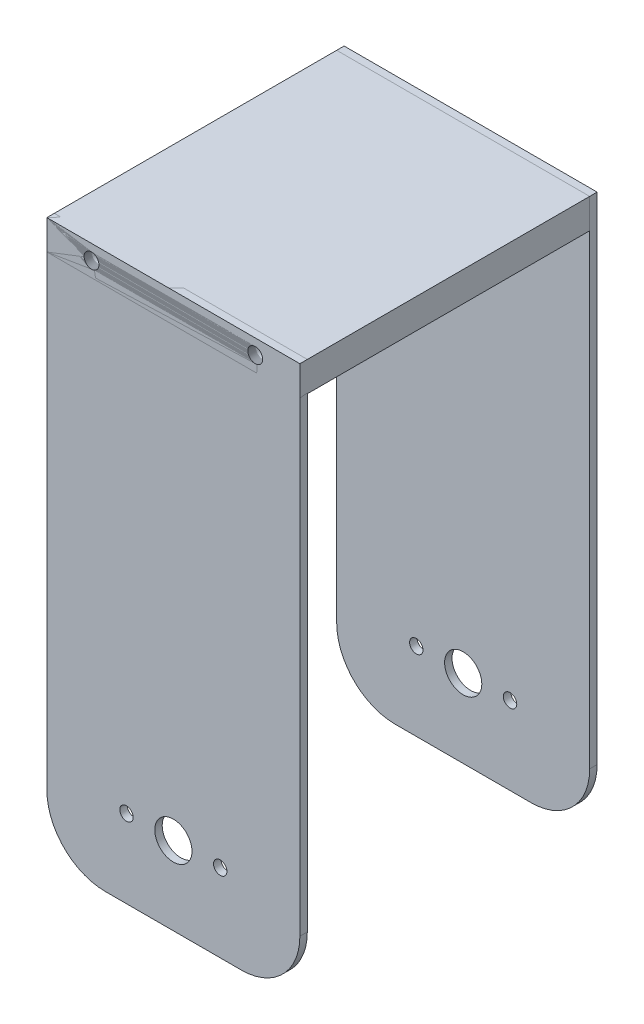
ISO-10303-21;
HEADER;
FILE_DESCRIPTION(('STEP AP214'),'2;1');
FILE_NAME('part.step','',(''),(''),'','','');
FILE_SCHEMA(('AUTOMOTIVE_DESIGN { 1 0 10303 214 1 1 1 1 }'));
ENDSEC;
DATA;
#1=APPLICATION_CONTEXT('core data for automotive mechanical design processes');
#2=APPLICATION_PROTOCOL_DEFINITION('international standard','automotive_design',2000,#1);
#3=PRODUCT_CONTEXT('',#1,'mechanical');
#4=PRODUCT('Part','Part','',(#3));
#5=PRODUCT_RELATED_PRODUCT_CATEGORY('part','',(#4));
#6=PRODUCT_DEFINITION_FORMATION('','',#4);
#7=PRODUCT_DEFINITION_CONTEXT('part definition',#1,'design');
#8=PRODUCT_DEFINITION('design','',#6,#7);
#9=PRODUCT_DEFINITION_SHAPE('','',#8);
#10=(LENGTH_UNIT() NAMED_UNIT(*) SI_UNIT(.MILLI.,.METRE.));
#11=(NAMED_UNIT(*) PLANE_ANGLE_UNIT() SI_UNIT($,.RADIAN.));
#12=(NAMED_UNIT(*) SI_UNIT($,.STERADIAN.) SOLID_ANGLE_UNIT());
#13=UNCERTAINTY_MEASURE_WITH_UNIT(LENGTH_MEASURE(1.E-05),#10,'distance_accuracy_value','');
#14=(GEOMETRIC_REPRESENTATION_CONTEXT(3) GLOBAL_UNCERTAINTY_ASSIGNED_CONTEXT((#13)) GLOBAL_UNIT_ASSIGNED_CONTEXT((#10,
#11,#12)) REPRESENTATION_CONTEXT('',''));
#15=CARTESIAN_POINT('',(0.,0.,0.));
#16=DIRECTION('',(0.,0.,1.));
#17=DIRECTION('',(1.,0.,0.));
#18=AXIS2_PLACEMENT_3D('',#15,#16,#17);
#19=CARTESIAN_POINT('',(630.554395844687,922.915784616967,1379.59948091337));
#20=DIRECTION('',(1.,0.,0.));
#21=DIRECTION('',(0.,1.,0.));
#22=AXIS2_PLACEMENT_3D('',#19,#20,#21);
#23=PLANE('',#22);
#24=DIRECTION('',(0.,-1.,0.));
#25=VECTOR('',#24,1.);
#26=CARTESIAN_POINT('',(630.554395844687,922.915784616967,1255.94948091337));
#27=LINE('',#26,#25);
#28=CARTESIAN_POINT('',(630.554395844687,922.915784616967,1255.94948091337));
#29=VERTEX_POINT('',#28);
#30=CARTESIAN_POINT('',(630.554395844687,910.215784616967,1255.94948091337));
#31=VERTEX_POINT('',#30);
#32=EDGE_CURVE('P0_E83',#29,#31,#27,.T.);
#33=ORIENTED_EDGE('',*,*,#32,.T.);
#34=DIRECTION('',(0.,0.,-1.));
#35=VECTOR('',#34,1.);
#36=CARTESIAN_POINT('',(630.554395844687,910.215784616967,1379.59948091337));
#37=LINE('',#36,#35);
#38=CARTESIAN_POINT('',(630.554395844687,910.215784616967,1379.59948091337));
#39=VERTEX_POINT('',#38);
#40=EDGE_CURVE('P0_E12',#39,#31,#37,.T.);
#41=ORIENTED_EDGE('',*,*,#40,.F.);
#42=DIRECTION('',(0.,-1.,0.));
#43=VECTOR('',#42,1.);
#44=CARTESIAN_POINT('',(630.554395844687,922.915784616967,1379.59948091337));
#45=LINE('',#44,#43);
#46=CARTESIAN_POINT('',(630.554395844687,922.915784616967,1379.59948091337));
#47=VERTEX_POINT('',#46);
#48=EDGE_CURVE('P0_E71',#47,#39,#45,.T.);
#49=ORIENTED_EDGE('',*,*,#48,.F.);
#50=DIRECTION('',(0.,0.,-1.));
#51=VECTOR('',#50,1.);
#52=CARTESIAN_POINT('',(630.554395844687,922.915784616967,1379.59948091337));
#53=LINE('',#52,#51);
#54=EDGE_CURVE('P0_E79',#47,#29,#53,.T.);
#55=ORIENTED_EDGE('',*,*,#54,.T.);
#56=EDGE_LOOP('',(#33,#41,#49,#55));
#57=FACE_BOUND('',#56,.T.);
#58=ADVANCED_FACE('P0_F20',(#57),#23,.F.);
#59=CARTESIAN_POINT('',(630.554395844687,910.215784616967,1379.59948091337));
#60=DIRECTION('',(0.,1.,0.));
#61=DIRECTION('',(0.,0.,1.));
#62=AXIS2_PLACEMENT_3D('',#59,#60,#61);
#63=PLANE('',#62);
#64=DIRECTION('',(1.,0.,0.));
#65=VECTOR('',#64,1.);
#66=CARTESIAN_POINT('',(630.554395844687,910.215784616967,1255.94948091337));
#67=LINE('',#66,#65);
#68=CARTESIAN_POINT('',(738.504395844687,910.215784616967,1255.94948091337));
#69=VERTEX_POINT('',#68);
#70=EDGE_CURVE('P0_E75',#31,#69,#67,.T.);
#71=ORIENTED_EDGE('',*,*,#70,.T.);
#72=DIRECTION('',(0.,0.,-1.));
#73=VECTOR('',#72,1.);
#74=CARTESIAN_POINT('',(738.504395844687,910.215784616967,1379.59948091337));
#75=LINE('',#74,#73);
#76=CARTESIAN_POINT('',(738.504395844687,910.215784616967,1379.59948091337));
#77=VERTEX_POINT('',#76);
#78=EDGE_CURVE('P0_E28',#77,#69,#75,.T.);
#79=ORIENTED_EDGE('',*,*,#78,.F.);
#80=DIRECTION('',(1.,0.,0.));
#81=VECTOR('',#80,1.);
#82=CARTESIAN_POINT('',(630.554395844687,910.215784616967,1379.59948091337));
#83=LINE('',#82,#81);
#84=EDGE_CURVE('P0_E66',#39,#77,#83,.T.);
#85=ORIENTED_EDGE('',*,*,#84,.F.);
#86=ORIENTED_EDGE('',*,*,#40,.T.);
#87=EDGE_LOOP('',(#71,#79,#85,#86));
#88=FACE_BOUND('',#87,.T.);
#89=ADVANCED_FACE('P0_F74',(#88),#63,.F.);
#90=CARTESIAN_POINT('',(738.504395844687,922.915784616967,1379.59948091337));
#91=DIRECTION('',(-1.,0.,0.));
#92=DIRECTION('',(0.,0.,1.));
#93=AXIS2_PLACEMENT_3D('',#90,#91,#92);
#94=PLANE('',#93);
#95=DIRECTION('',(0.,1.,0.));
#96=VECTOR('',#95,1.);
#97=CARTESIAN_POINT('',(738.504395844687,922.915784616967,1255.94948091337));
#98=LINE('',#97,#96);
#99=CARTESIAN_POINT('',(738.504395844687,922.915784616967,1255.94948091337));
#100=VERTEX_POINT('',#99);
#101=EDGE_CURVE('P0_E53',#69,#100,#98,.T.);
#102=ORIENTED_EDGE('',*,*,#101,.T.);
#103=DIRECTION('',(0.,0.,-1.));
#104=VECTOR('',#103,1.);
#105=CARTESIAN_POINT('',(738.504395844687,922.915784616967,1379.59948091337));
#106=LINE('',#105,#104);
#107=CARTESIAN_POINT('',(738.504395844687,922.915784616967,1379.59948091337));
#108=VERTEX_POINT('',#107);
#109=EDGE_CURVE('P0_E76',#108,#100,#106,.T.);
#110=ORIENTED_EDGE('',*,*,#109,.F.);
#111=DIRECTION('',(0.,1.,0.));
#112=VECTOR('',#111,1.);
#113=CARTESIAN_POINT('',(738.504395844687,922.915784616967,1379.59948091337));
#114=LINE('',#113,#112);
#115=EDGE_CURVE('P0_E69',#77,#108,#114,.T.);
#116=ORIENTED_EDGE('',*,*,#115,.F.);
#117=ORIENTED_EDGE('',*,*,#78,.T.);
#118=EDGE_LOOP('',(#102,#110,#116,#117));
#119=FACE_BOUND('',#118,.T.);
#120=ADVANCED_FACE('P0_F77',(#119),#94,.F.);
#121=CARTESIAN_POINT('',(630.554395844687,922.915784616967,1379.59948091337));
#122=DIRECTION('',(0.,-1.,0.));
#123=DIRECTION('',(0.,0.,-1.));
#124=AXIS2_PLACEMENT_3D('',#121,#122,#123);
#125=PLANE('',#124);
#126=DIRECTION('',(-1.,0.,0.));
#127=VECTOR('',#126,1.);
#128=CARTESIAN_POINT('',(630.554395844687,922.915784616967,1255.94948091337));
#129=LINE('',#128,#127);
#130=EDGE_CURVE('P0_E59',#100,#29,#129,.T.);
#131=ORIENTED_EDGE('',*,*,#130,.T.);
#132=ORIENTED_EDGE('',*,*,#54,.F.);
#133=DIRECTION('',(-1.,0.,0.));
#134=VECTOR('',#133,1.);
#135=CARTESIAN_POINT('',(630.554395844687,922.915784616967,1379.59948091337));
#136=LINE('',#135,#134);
#137=EDGE_CURVE('P0_E36',#108,#47,#136,.T.);
#138=ORIENTED_EDGE('',*,*,#137,.F.);
#139=ORIENTED_EDGE('',*,*,#109,.T.);
#140=EDGE_LOOP('',(#131,#132,#138,#139));
#141=FACE_BOUND('',#140,.T.);
#142=ADVANCED_FACE('P0_F161',(#141),#125,.F.);
#143=CARTESIAN_POINT('',(630.554395844687,922.915784616967,1379.59948091337));
#144=DIRECTION('',(0.,0.,1.));
#145=DIRECTION('',(1.,0.,0.));
#146=AXIS2_PLACEMENT_3D('',#143,#144,#145);
#147=PLANE('',#146);
#148=CARTESIAN_POINT('',(649.604395844687,916.565784616967,1379.59948091337));
#149=DIRECTION('',(0.,0.,1.));
#150=DIRECTION('',(1.,0.,0.));
#151=AXIS2_PLACEMENT_3D('',#148,#149,#150);
#152=CIRCLE('',#151,3.175);
#153=CARTESIAN_POINT('',(652.779395844687,916.565784616967,1379.59948091337));
#154=VERTEX_POINT('',#153);
#155=EDGE_CURVE('P0_E97',#154,#154,#152,.T.);
#156=ORIENTED_EDGE('',*,*,#155,.F.);
#157=EDGE_LOOP('',(#156));
#158=FACE_BOUND('',#157,.T.);
#159=CARTESIAN_POINT('',(719.454395844687,916.565784616967,1379.59948091337));
#160=DIRECTION('',(0.,0.,1.));
#161=DIRECTION('',(1.,0.,0.));
#162=AXIS2_PLACEMENT_3D('',#159,#160,#161);
#163=CIRCLE('',#162,3.175);
#164=CARTESIAN_POINT('',(722.629395844687,916.565784616967,1379.59948091337));
#165=VERTEX_POINT('',#164);
#166=EDGE_CURVE('P0_E102',#165,#165,#163,.T.);
#167=ORIENTED_EDGE('',*,*,#166,.F.);
#168=EDGE_LOOP('',(#167));
#169=FACE_BOUND('',#168,.T.);
#170=ORIENTED_EDGE('',*,*,#48,.T.);
#171=ORIENTED_EDGE('',*,*,#84,.T.);
#172=ORIENTED_EDGE('',*,*,#115,.T.);
#173=ORIENTED_EDGE('',*,*,#137,.T.);
#174=EDGE_LOOP('',(#170,#171,#172,#173));
#175=FACE_BOUND('',#174,.T.);
#176=ADVANCED_FACE('P0_F67',(#158,#169,#175),#147,.T.);
#177=CARTESIAN_POINT('',(630.554395844687,922.915784616967,1255.94948091337));
#178=DIRECTION('',(0.,0.,1.));
#179=DIRECTION('',(1.,0.,0.));
#180=AXIS2_PLACEMENT_3D('',#177,#178,#179);
#181=PLANE('',#180);
#182=CARTESIAN_POINT('',(649.604395844687,916.565784616967,1255.94948091337));
#183=DIRECTION('',(0.,0.,1.));
#184=DIRECTION('',(1.,0.,0.));
#185=AXIS2_PLACEMENT_3D('',#182,#183,#184);
#186=CIRCLE('',#185,3.175);
#187=CARTESIAN_POINT('',(652.779395844687,916.565784616967,1255.94948091337));
#188=VERTEX_POINT('',#187);
#189=EDGE_CURVE('P0_E117',#188,#188,#186,.T.);
#190=ORIENTED_EDGE('',*,*,#189,.T.);
#191=EDGE_LOOP('',(#190));
#192=FACE_BOUND('',#191,.T.);
#193=CARTESIAN_POINT('',(719.454395844687,916.565784616967,1255.94948091337));
#194=DIRECTION('',(0.,0.,1.));
#195=DIRECTION('',(1.,0.,0.));
#196=AXIS2_PLACEMENT_3D('',#193,#194,#195);
#197=CIRCLE('',#196,3.175);
#198=CARTESIAN_POINT('',(722.629395844687,916.565784616967,1255.94948091337));
#199=VERTEX_POINT('',#198);
#200=EDGE_CURVE('P0_E118',#199,#199,#197,.T.);
#201=ORIENTED_EDGE('',*,*,#200,.T.);
#202=EDGE_LOOP('',(#201));
#203=FACE_BOUND('',#202,.T.);
#204=ORIENTED_EDGE('',*,*,#32,.F.);
#205=ORIENTED_EDGE('',*,*,#130,.F.);
#206=ORIENTED_EDGE('',*,*,#101,.F.);
#207=ORIENTED_EDGE('',*,*,#70,.F.);
#208=EDGE_LOOP('',(#204,#205,#206,#207));
#209=FACE_BOUND('',#208,.T.);
#210=ADVANCED_FACE('P0_F123',(#192,#203,#209),#181,.F.);
#211=CARTESIAN_POINT('',(719.454395844687,916.565784616967,1354.19948091337));
#212=DIRECTION('',(0.,0.,1.));
#213=DIRECTION('',(1.,0.,0.));
#214=AXIS2_PLACEMENT_3D('',#211,#212,#213);
#215=CYLINDRICAL_SURFACE('',#214,3.175);
#216=CARTESIAN_POINT('',(719.454395844687,916.565784616967,1354.19948091337));
#217=DIRECTION('',(0.,0.,1.));
#218=DIRECTION('',(1.,0.,0.));
#219=AXIS2_PLACEMENT_3D('',#216,#217,#218);
#220=CIRCLE('',#219,3.175);
#221=CARTESIAN_POINT('',(722.629395844687,916.565784616967,1354.19948091337));
#222=VERTEX_POINT('',#221);
#223=EDGE_CURVE('P0_E107',#222,#222,#220,.T.);
#224=ORIENTED_EDGE('',*,*,#223,.F.);
#225=EDGE_LOOP('',(#224));
#226=FACE_BOUND('',#225,.T.);
#227=ORIENTED_EDGE('',*,*,#166,.T.);
#228=EDGE_LOOP('',(#227));
#229=FACE_BOUND('',#228,.T.);
#230=ADVANCED_FACE('P0_F151',(#226,#229),#215,.F.);
#231=CARTESIAN_POINT('',(719.454395844687,916.565784616967,1354.19948091337));
#232=DIRECTION('',(0.,0.,1.));
#233=DIRECTION('',(1.,0.,0.));
#234=AXIS2_PLACEMENT_3D('',#231,#232,#233);
#235=PLANE('',#234);
#236=ORIENTED_EDGE('',*,*,#223,.T.);
#237=EDGE_LOOP('',(#236));
#238=FACE_BOUND('',#237,.T.);
#239=ADVANCED_FACE('P0_F158',(#238),#235,.T.);
#240=CARTESIAN_POINT('',(649.604395844687,916.565784616967,1354.19948091337));
#241=DIRECTION('',(0.,0.,1.));
#242=DIRECTION('',(1.,0.,0.));
#243=AXIS2_PLACEMENT_3D('',#240,#241,#242);
#244=CYLINDRICAL_SURFACE('',#243,3.175);
#245=CARTESIAN_POINT('',(649.604395844687,916.565784616967,1354.19948091337));
#246=DIRECTION('',(0.,0.,1.));
#247=DIRECTION('',(1.,0.,0.));
#248=AXIS2_PLACEMENT_3D('',#245,#246,#247);
#249=CIRCLE('',#248,3.175);
#250=CARTESIAN_POINT('',(652.779395844687,916.565784616967,1354.19948091337));
#251=VERTEX_POINT('',#250);
#252=EDGE_CURVE('P0_E86',#251,#251,#249,.T.);
#253=ORIENTED_EDGE('',*,*,#252,.F.);
#254=EDGE_LOOP('',(#253));
#255=FACE_BOUND('',#254,.T.);
#256=ORIENTED_EDGE('',*,*,#155,.T.);
#257=EDGE_LOOP('',(#256));
#258=FACE_BOUND('',#257,.T.);
#259=ADVANCED_FACE('P0_F140',(#255,#258),#244,.F.);
#260=CARTESIAN_POINT('',(649.604395844687,916.565784616967,1354.19948091337));
#261=DIRECTION('',(0.,0.,1.));
#262=DIRECTION('',(1.,0.,0.));
#263=AXIS2_PLACEMENT_3D('',#260,#261,#262);
#264=PLANE('',#263);
#265=ORIENTED_EDGE('',*,*,#252,.T.);
#266=EDGE_LOOP('',(#265));
#267=FACE_BOUND('',#266,.T.);
#268=ADVANCED_FACE('P0_F129',(#267),#264,.T.);
#269=CARTESIAN_POINT('',(719.454395844687,916.565784616967,1281.34948091337));
#270=DIRECTION('',(0.,0.,-1.));
#271=DIRECTION('',(-1.,0.,0.));
#272=AXIS2_PLACEMENT_3D('',#269,#270,#271);
#273=CYLINDRICAL_SURFACE('',#272,3.175);
#274=CARTESIAN_POINT('',(719.454395844687,916.565784616967,1281.34948091337));
#275=DIRECTION('',(0.,0.,1.));
#276=DIRECTION('',(1.,0.,0.));
#277=AXIS2_PLACEMENT_3D('',#274,#275,#276);
#278=CIRCLE('',#277,3.175);
#279=CARTESIAN_POINT('',(722.629395844687,916.565784616967,1281.34948091337));
#280=VERTEX_POINT('',#279);
#281=EDGE_CURVE('P0_E114',#280,#280,#278,.T.);
#282=ORIENTED_EDGE('',*,*,#281,.T.);
#283=EDGE_LOOP('',(#282));
#284=FACE_BOUND('',#283,.T.);
#285=ORIENTED_EDGE('',*,*,#200,.F.);
#286=EDGE_LOOP('',(#285));
#287=FACE_BOUND('',#286,.T.);
#288=ADVANCED_FACE('P0_F126',(#284,#287),#273,.F.);
#289=CARTESIAN_POINT('',(719.454395844687,916.565784616967,1281.34948091337));
#290=DIRECTION('',(0.,0.,-1.));
#291=DIRECTION('',(1.,0.,0.));
#292=AXIS2_PLACEMENT_3D('',#289,#290,#291);
#293=PLANE('',#292);
#294=ORIENTED_EDGE('',*,*,#281,.F.);
#295=EDGE_LOOP('',(#294));
#296=FACE_BOUND('',#295,.T.);
#297=ADVANCED_FACE('P0_F128',(#296),#293,.T.);
#298=CARTESIAN_POINT('',(649.604395844687,916.565784616967,1281.34948091337));
#299=DIRECTION('',(0.,0.,-1.));
#300=DIRECTION('',(-1.,0.,0.));
#301=AXIS2_PLACEMENT_3D('',#298,#299,#300);
#302=CYLINDRICAL_SURFACE('',#301,3.175);
#303=CARTESIAN_POINT('',(649.604395844687,916.565784616967,1281.34948091337));
#304=DIRECTION('',(0.,0.,1.));
#305=DIRECTION('',(1.,0.,0.));
#306=AXIS2_PLACEMENT_3D('',#303,#304,#305);
#307=CIRCLE('',#306,3.175);
#308=CARTESIAN_POINT('',(652.779395844687,916.565784616967,1281.34948091337));
#309=VERTEX_POINT('',#308);
#310=EDGE_CURVE('P0_E110',#309,#309,#307,.T.);
#311=ORIENTED_EDGE('',*,*,#310,.T.);
#312=EDGE_LOOP('',(#311));
#313=FACE_BOUND('',#312,.T.);
#314=ORIENTED_EDGE('',*,*,#189,.F.);
#315=EDGE_LOOP('',(#314));
#316=FACE_BOUND('',#315,.T.);
#317=ADVANCED_FACE('P0_F136',(#313,#316),#302,.F.);
#318=CARTESIAN_POINT('',(649.604395844687,916.565784616967,1281.34948091337));
#319=DIRECTION('',(0.,0.,-1.));
#320=DIRECTION('',(1.,0.,0.));
#321=AXIS2_PLACEMENT_3D('',#318,#319,#320);
#322=PLANE('',#321);
#323=ORIENTED_EDGE('',*,*,#310,.F.);
#324=EDGE_LOOP('',(#323));
#325=FACE_BOUND('',#324,.T.);
#326=ADVANCED_FACE('P0_F250',(#325),#322,.T.);
#327=CLOSED_SHELL('',(#58,#89,#120,#142,#176,#210,#230,#239,#259,#268,#288,#297,#317,#326));
#328=MANIFOLD_SOLID_BREP('P0_B1',#327);
#329=CARTESIAN_POINT('',(684.529395844687,804.648284616967,1376.42448091337));
#330=DIRECTION('',(0.,0.,-1.));
#331=DIRECTION('',(-1.,0.,0.));
#332=AXIS2_PLACEMENT_3D('',#329,#330,#331);
#333=PLANE('',#332);
#334=CARTESIAN_POINT('',(719.454395844687,916.565784616967,1376.42448091337));
#335=DIRECTION('',(0.,0.,-1.));
#336=DIRECTION('',(-1.,0.,0.));
#337=AXIS2_PLACEMENT_3D('',#334,#335,#336);
#338=CIRCLE('',#337,3.175);
#339=CARTESIAN_POINT('',(716.279395844687,916.565784616967,1376.42448091337));
#340=VERTEX_POINT('',#339);
#341=EDGE_CURVE('P1_E164',#340,#340,#338,.T.);
#342=ORIENTED_EDGE('',*,*,#341,.F.);
#343=EDGE_LOOP('',(#342));
#344=FACE_BOUND('',#343,.T.);
#345=CARTESIAN_POINT('',(664.529395844687,719.720784616967,1376.42448091337));
#346=DIRECTION('',(0.,0.,-1.));
#347=DIRECTION('',(-1.,0.,0.));
#348=AXIS2_PLACEMENT_3D('',#345,#346,#347);
#349=CIRCLE('',#348,2.86);
#350=CARTESIAN_POINT('',(661.669395844687,719.720784616967,1376.42448091337));
#351=VERTEX_POINT('',#350);
#352=EDGE_CURVE('P1_E146',#351,#351,#349,.T.);
#353=ORIENTED_EDGE('',*,*,#352,.F.);
#354=EDGE_LOOP('',(#353));
#355=FACE_BOUND('',#354,.T.);
#356=DIRECTION('',(0.,-1.,0.));
#357=VECTOR('',#356,1.);
#358=CARTESIAN_POINT('',(738.504395844687,922.915784616967,1376.42448091337));
#359=LINE('',#358,#357);
#360=CARTESIAN_POINT('',(738.504395844687,922.915784616967,1376.42448091337));
#361=VERTEX_POINT('',#360);
#362=CARTESIAN_POINT('',(738.504395844687,711.380784616966,1376.42448091337));
#363=VERTEX_POINT('',#362);
#364=EDGE_CURVE('P1_E89',#361,#363,#359,.T.);
#365=ORIENTED_EDGE('',*,*,#364,.T.);
#366=CARTESIAN_POINT('',(713.504395844687,711.380784616966,1376.42448091337));
#367=DIRECTION('',(0.,0.,-1.));
#368=DIRECTION('',(-1.,0.,0.));
#369=AXIS2_PLACEMENT_3D('',#366,#367,#368);
#370=CIRCLE('',#369,25.);
#371=CARTESIAN_POINT('',(713.504395844687,686.380784616966,1376.42448091337));
#372=VERTEX_POINT('',#371);
#373=EDGE_CURVE('P1_E28',#363,#372,#370,.T.);
#374=ORIENTED_EDGE('',*,*,#373,.T.);
#375=DIRECTION('',(-1.,0.,0.));
#376=VECTOR('',#375,1.);
#377=CARTESIAN_POINT('',(738.504395844687,686.380784616966,1376.42448091337));
#378=LINE('',#377,#376);
#379=CARTESIAN_POINT('',(655.554395844687,686.380784616966,1376.42448091337));
#380=VERTEX_POINT('',#379);
#381=EDGE_CURVE('P1_E99',#372,#380,#378,.T.);
#382=ORIENTED_EDGE('',*,*,#381,.T.);
#383=CARTESIAN_POINT('',(655.554395844687,711.380784616966,1376.42448091337));
#384=DIRECTION('',(0.,0.,-1.));
#385=DIRECTION('',(-1.,0.,0.));
#386=AXIS2_PLACEMENT_3D('',#383,#384,#385);
#387=CIRCLE('',#386,25.);
#388=CARTESIAN_POINT('',(630.554395844687,711.380784616966,1376.42448091337));
#389=VERTEX_POINT('',#388);
#390=EDGE_CURVE('P1_E35',#380,#389,#387,.T.);
#391=ORIENTED_EDGE('',*,*,#390,.T.);
#392=DIRECTION('',(0.,1.,0.));
#393=VECTOR('',#392,1.);
#394=CARTESIAN_POINT('',(630.554395844687,922.915784616967,1376.42448091337));
#395=LINE('',#394,#393);
#396=CARTESIAN_POINT('',(630.554395844687,922.915784616967,1376.42448091337));
#397=VERTEX_POINT('',#396);
#398=EDGE_CURVE('P1_E73',#389,#397,#395,.T.);
#399=ORIENTED_EDGE('',*,*,#398,.T.);
#400=DIRECTION('',(1.,0.,0.));
#401=VECTOR('',#400,1.);
#402=CARTESIAN_POINT('',(738.504395844687,922.915784616967,1376.42448091337));
#403=LINE('',#402,#401);
#404=EDGE_CURVE('P1_E76',#397,#361,#403,.T.);
#405=ORIENTED_EDGE('',*,*,#404,.T.);
#406=EDGE_LOOP('',(#365,#374,#382,#391,#399,#405));
#407=FACE_BOUND('',#406,.T.);
#408=CARTESIAN_POINT('',(684.529395844687,719.720784616967,1376.42448091337));
#409=DIRECTION('',(0.,0.,-1.));
#410=DIRECTION('',(-1.,0.,0.));
#411=AXIS2_PLACEMENT_3D('',#408,#409,#410);
#412=CIRCLE('',#411,7.94);
#413=CARTESIAN_POINT('',(676.589395844687,719.720784616967,1376.42448091337));
#414=VERTEX_POINT('',#413);
#415=EDGE_CURVE('P1_E132',#414,#414,#412,.T.);
#416=ORIENTED_EDGE('',*,*,#415,.F.);
#417=EDGE_LOOP('',(#416));
#418=FACE_BOUND('',#417,.T.);
#419=CARTESIAN_POINT('',(704.529395844687,719.720784616967,1376.42448091337));
#420=DIRECTION('',(0.,0.,-1.));
#421=DIRECTION('',(-1.,0.,0.));
#422=AXIS2_PLACEMENT_3D('',#419,#420,#421);
#423=CIRCLE('',#422,2.86);
#424=CARTESIAN_POINT('',(701.669395844687,719.720784616967,1376.42448091337));
#425=VERTEX_POINT('',#424);
#426=EDGE_CURVE('P1_E152',#425,#425,#423,.T.);
#427=ORIENTED_EDGE('',*,*,#426,.F.);
#428=EDGE_LOOP('',(#427));
#429=FACE_BOUND('',#428,.T.);
#430=CARTESIAN_POINT('',(649.604395844687,916.565784616967,1376.42448091337));
#431=DIRECTION('',(0.,0.,-1.));
#432=DIRECTION('',(-1.,0.,0.));
#433=AXIS2_PLACEMENT_3D('',#430,#431,#432);
#434=CIRCLE('',#433,3.175);
#435=CARTESIAN_POINT('',(646.429395844687,916.565784616967,1376.42448091337));
#436=VERTEX_POINT('',#435);
#437=EDGE_CURVE('P1_E177',#436,#436,#434,.T.);
#438=ORIENTED_EDGE('',*,*,#437,.F.);
#439=EDGE_LOOP('',(#438));
#440=FACE_BOUND('',#439,.T.);
#441=ADVANCED_FACE('P1_F20',(#344,#355,#407,#418,#429,#440),#333,.T.);
#442=CARTESIAN_POINT('',(684.529395844687,804.648284616967,1379.59948091337));
#443=DIRECTION('',(0.,0.,-1.));
#444=DIRECTION('',(-1.,0.,0.));
#445=AXIS2_PLACEMENT_3D('',#442,#443,#444);
#446=PLANE('',#445);
#447=DIRECTION('',(-1.,0.,0.));
#448=VECTOR('',#447,1.);
#449=CARTESIAN_POINT('',(738.504395844687,686.380784616966,1379.59948091337));
#450=LINE('',#449,#448);
#451=CARTESIAN_POINT('',(713.504395844687,686.380784616966,1379.59948091337));
#452=VERTEX_POINT('',#451);
#453=CARTESIAN_POINT('',(655.554395844687,686.380784616966,1379.59948091337));
#454=VERTEX_POINT('',#453);
#455=EDGE_CURVE('P1_E81',#452,#454,#450,.T.);
#456=ORIENTED_EDGE('',*,*,#455,.F.);
#457=CARTESIAN_POINT('',(713.504395844687,711.380784616966,1379.59948091337));
#458=DIRECTION('',(0.,0.,-1.));
#459=DIRECTION('',(-1.,0.,0.));
#460=AXIS2_PLACEMENT_3D('',#457,#458,#459);
#461=CIRCLE('',#460,25.);
#462=CARTESIAN_POINT('',(738.504395844687,711.380784616966,1379.59948091337));
#463=VERTEX_POINT('',#462);
#464=EDGE_CURVE('P1_E107',#452,#463,#461,.F.);
#465=ORIENTED_EDGE('',*,*,#464,.T.);
#466=DIRECTION('',(0.,-1.,0.));
#467=VECTOR('',#466,1.);
#468=CARTESIAN_POINT('',(738.504395844687,922.915784616967,1379.59948091337));
#469=LINE('',#468,#467);
#470=CARTESIAN_POINT('',(738.504395844687,922.915784616967,1379.59948091337));
#471=VERTEX_POINT('',#470);
#472=EDGE_CURVE('P1_E125',#471,#463,#469,.T.);
#473=ORIENTED_EDGE('',*,*,#472,.F.);
#474=DIRECTION('',(1.,0.,0.));
#475=VECTOR('',#474,1.);
#476=CARTESIAN_POINT('',(738.504395844687,922.915784616967,1379.59948091337));
#477=LINE('',#476,#475);
#478=CARTESIAN_POINT('',(630.554395844687,922.915784616967,1379.59948091337));
#479=VERTEX_POINT('',#478);
#480=EDGE_CURVE('P1_E127',#479,#471,#477,.T.);
#481=ORIENTED_EDGE('',*,*,#480,.F.);
#482=DIRECTION('',(0.,1.,0.));
#483=VECTOR('',#482,1.);
#484=CARTESIAN_POINT('',(630.554395844687,922.915784616967,1379.59948091337));
#485=LINE('',#484,#483);
#486=CARTESIAN_POINT('',(630.554395844687,711.380784616966,1379.59948091337));
#487=VERTEX_POINT('',#486);
#488=EDGE_CURVE('P1_E93',#487,#479,#485,.T.);
#489=ORIENTED_EDGE('',*,*,#488,.F.);
#490=CARTESIAN_POINT('',(655.554395844687,711.380784616966,1379.59948091337));
#491=DIRECTION('',(0.,0.,-1.));
#492=DIRECTION('',(-1.,0.,0.));
#493=AXIS2_PLACEMENT_3D('',#490,#491,#492);
#494=CIRCLE('',#493,25.);
#495=EDGE_CURVE('P1_E105',#487,#454,#494,.F.);
#496=ORIENTED_EDGE('',*,*,#495,.T.);
#497=EDGE_LOOP('',(#456,#465,#473,#481,#489,#496));
#498=FACE_BOUND('',#497,.T.);
#499=CARTESIAN_POINT('',(684.529395844687,719.720784616967,1379.59948091337));
#500=DIRECTION('',(0.,0.,-1.));
#501=DIRECTION('',(-1.,0.,0.));
#502=AXIS2_PLACEMENT_3D('',#499,#500,#501);
#503=CIRCLE('',#502,7.94);
#504=CARTESIAN_POINT('',(676.589395844687,719.720784616967,1379.59948091337));
#505=VERTEX_POINT('',#504);
#506=EDGE_CURVE('P1_E143',#505,#505,#503,.T.);
#507=ORIENTED_EDGE('',*,*,#506,.T.);
#508=EDGE_LOOP('',(#507));
#509=FACE_BOUND('',#508,.T.);
#510=CARTESIAN_POINT('',(664.529395844687,719.720784616967,1379.59948091337));
#511=DIRECTION('',(0.,0.,-1.));
#512=DIRECTION('',(-1.,0.,0.));
#513=AXIS2_PLACEMENT_3D('',#510,#511,#512);
#514=CIRCLE('',#513,2.86);
#515=CARTESIAN_POINT('',(661.669395844687,719.720784616967,1379.59948091337));
#516=VERTEX_POINT('',#515);
#517=EDGE_CURVE('P1_E148',#516,#516,#514,.T.);
#518=ORIENTED_EDGE('',*,*,#517,.T.);
#519=EDGE_LOOP('',(#518));
#520=FACE_BOUND('',#519,.T.);
#521=CARTESIAN_POINT('',(704.529395844687,719.720784616967,1379.59948091337));
#522=DIRECTION('',(0.,0.,-1.));
#523=DIRECTION('',(-1.,0.,0.));
#524=AXIS2_PLACEMENT_3D('',#521,#522,#523);
#525=CIRCLE('',#524,2.86);
#526=CARTESIAN_POINT('',(701.669395844687,719.720784616967,1379.59948091337));
#527=VERTEX_POINT('',#526);
#528=EDGE_CURVE('P1_E161',#527,#527,#525,.T.);
#529=ORIENTED_EDGE('',*,*,#528,.T.);
#530=EDGE_LOOP('',(#529));
#531=FACE_BOUND('',#530,.T.);
#532=CARTESIAN_POINT('',(719.454395844687,916.565784616967,1379.59948091337));
#533=DIRECTION('',(0.,0.,-1.));
#534=DIRECTION('',(-1.,0.,0.));
#535=AXIS2_PLACEMENT_3D('',#532,#533,#534);
#536=CIRCLE('',#535,3.175);
#537=CARTESIAN_POINT('',(716.279395844687,916.565784616967,1379.59948091337));
#538=VERTEX_POINT('',#537);
#539=EDGE_CURVE('P1_E173',#538,#538,#536,.T.);
#540=ORIENTED_EDGE('',*,*,#539,.T.);
#541=EDGE_LOOP('',(#540));
#542=FACE_BOUND('',#541,.T.);
#543=CARTESIAN_POINT('',(649.604395844687,916.565784616967,1379.59948091337));
#544=DIRECTION('',(0.,0.,-1.));
#545=DIRECTION('',(-1.,0.,0.));
#546=AXIS2_PLACEMENT_3D('',#543,#544,#545);
#547=CIRCLE('',#546,3.175);
#548=CARTESIAN_POINT('',(646.429395844687,916.565784616967,1379.59948091337));
#549=VERTEX_POINT('',#548);
#550=EDGE_CURVE('P1_E182',#549,#549,#547,.T.);
#551=ORIENTED_EDGE('',*,*,#550,.T.);
#552=EDGE_LOOP('',(#551));
#553=FACE_BOUND('',#552,.T.);
#554=ADVANCED_FACE('P1_F123',(#498,#509,#520,#531,#542,#553),#446,.F.);
#555=CARTESIAN_POINT('',(630.554395844687,922.915784616967,1376.42448091337));
#556=DIRECTION('',(1.,0.,0.));
#557=DIRECTION('',(0.,-1.,0.));
#558=AXIS2_PLACEMENT_3D('',#555,#556,#557);
#559=PLANE('',#558);
#560=ORIENTED_EDGE('',*,*,#398,.F.);
#561=DIRECTION('',(0.,0.,1.));
#562=VECTOR('',#561,1.);
#563=CARTESIAN_POINT('',(630.554395844687,711.380784616966,1376.42448091337));
#564=LINE('',#563,#562);
#565=EDGE_CURVE('P1_E12',#389,#487,#564,.T.);
#566=ORIENTED_EDGE('',*,*,#565,.T.);
#567=ORIENTED_EDGE('',*,*,#488,.T.);
#568=DIRECTION('',(0.,0.,1.));
#569=VECTOR('',#568,1.);
#570=CARTESIAN_POINT('',(630.554395844687,922.915784616967,1376.42448091337));
#571=LINE('',#570,#569);
#572=EDGE_CURVE('P1_E86',#397,#479,#571,.T.);
#573=ORIENTED_EDGE('',*,*,#572,.F.);
#574=EDGE_LOOP('',(#560,#566,#567,#573));
#575=FACE_BOUND('',#574,.T.);
#576=ADVANCED_FACE('P1_F91',(#575),#559,.F.);
#577=CARTESIAN_POINT('',(738.504395844687,922.915784616967,1376.42448091337));
#578=DIRECTION('',(0.,-1.,0.));
#579=DIRECTION('',(-1.,0.,0.));
#580=AXIS2_PLACEMENT_3D('',#577,#578,#579);
#581=PLANE('',#580);
#582=ORIENTED_EDGE('',*,*,#480,.T.);
#583=DIRECTION('',(0.,0.,1.));
#584=VECTOR('',#583,1.);
#585=CARTESIAN_POINT('',(738.504395844687,922.915784616967,1376.42448091337));
#586=LINE('',#585,#584);
#587=EDGE_CURVE('P1_E88',#361,#471,#586,.T.);
#588=ORIENTED_EDGE('',*,*,#587,.F.);
#589=ORIENTED_EDGE('',*,*,#404,.F.);
#590=ORIENTED_EDGE('',*,*,#572,.T.);
#591=EDGE_LOOP('',(#582,#588,#589,#590));
#592=FACE_BOUND('',#591,.T.);
#593=ADVANCED_FACE('P1_F85',(#592),#581,.F.);
#594=CARTESIAN_POINT('',(738.504395844687,922.915784616967,1376.42448091337));
#595=DIRECTION('',(-1.,0.,0.));
#596=DIRECTION('',(0.,1.,0.));
#597=AXIS2_PLACEMENT_3D('',#594,#595,#596);
#598=PLANE('',#597);
#599=ORIENTED_EDGE('',*,*,#472,.T.);
#600=DIRECTION('',(0.,0.,1.));
#601=VECTOR('',#600,1.);
#602=CARTESIAN_POINT('',(738.504395844687,711.380784616966,1376.42448091337));
#603=LINE('',#602,#601);
#604=EDGE_CURVE('P1_E43',#463,#363,#603,.F.);
#605=ORIENTED_EDGE('',*,*,#604,.T.);
#606=ORIENTED_EDGE('',*,*,#364,.F.);
#607=ORIENTED_EDGE('',*,*,#587,.T.);
#608=EDGE_LOOP('',(#599,#605,#606,#607));
#609=FACE_BOUND('',#608,.T.);
#610=ADVANCED_FACE('P1_F126',(#609),#598,.F.);
#611=CARTESIAN_POINT('',(738.504395844687,686.380784616966,1376.42448091337));
#612=DIRECTION('',(0.,1.,0.));
#613=DIRECTION('',(1.,0.,0.));
#614=AXIS2_PLACEMENT_3D('',#611,#612,#613);
#615=PLANE('',#614);
#616=ORIENTED_EDGE('',*,*,#381,.F.);
#617=DIRECTION('',(0.,0.,1.));
#618=VECTOR('',#617,1.);
#619=CARTESIAN_POINT('',(713.504395844687,686.380784616966,1376.42448091337));
#620=LINE('',#619,#618);
#621=EDGE_CURVE('P1_E97',#372,#452,#620,.T.);
#622=ORIENTED_EDGE('',*,*,#621,.T.);
#623=ORIENTED_EDGE('',*,*,#455,.T.);
#624=DIRECTION('',(0.,0.,1.));
#625=VECTOR('',#624,1.);
#626=CARTESIAN_POINT('',(655.554395844687,686.380784616966,1376.42448091337));
#627=LINE('',#626,#625);
#628=EDGE_CURVE('P1_E95',#454,#380,#627,.F.);
#629=ORIENTED_EDGE('',*,*,#628,.T.);
#630=EDGE_LOOP('',(#616,#622,#623,#629));
#631=FACE_BOUND('',#630,.T.);
#632=ADVANCED_FACE('P1_F115',(#631),#615,.F.);
#633=CARTESIAN_POINT('',(684.529395844687,719.720784616967,1376.42448091337));
#634=DIRECTION('',(0.,0.,1.));
#635=DIRECTION('',(1.,0.,0.));
#636=AXIS2_PLACEMENT_3D('',#633,#634,#635);
#637=CYLINDRICAL_SURFACE('',#636,7.94);
#638=ORIENTED_EDGE('',*,*,#415,.T.);
#639=EDGE_LOOP('',(#638));
#640=FACE_BOUND('',#639,.T.);
#641=ORIENTED_EDGE('',*,*,#506,.F.);
#642=EDGE_LOOP('',(#641));
#643=FACE_BOUND('',#642,.T.);
#644=ADVANCED_FACE('P1_F205',(#640,#643),#637,.F.);
#645=CARTESIAN_POINT('',(664.529395844687,719.720784616967,1376.42448091337));
#646=DIRECTION('',(0.,0.,1.));
#647=DIRECTION('',(1.,0.,0.));
#648=AXIS2_PLACEMENT_3D('',#645,#646,#647);
#649=CYLINDRICAL_SURFACE('',#648,2.86);
#650=ORIENTED_EDGE('',*,*,#352,.T.);
#651=EDGE_LOOP('',(#650));
#652=FACE_BOUND('',#651,.T.);
#653=ORIENTED_EDGE('',*,*,#517,.F.);
#654=EDGE_LOOP('',(#653));
#655=FACE_BOUND('',#654,.T.);
#656=ADVANCED_FACE('P1_F231',(#652,#655),#649,.F.);
#657=CARTESIAN_POINT('',(704.529395844687,719.720784616967,1376.42448091337));
#658=DIRECTION('',(0.,0.,1.));
#659=DIRECTION('',(1.,0.,0.));
#660=AXIS2_PLACEMENT_3D('',#657,#658,#659);
#661=CYLINDRICAL_SURFACE('',#660,2.86);
#662=ORIENTED_EDGE('',*,*,#426,.T.);
#663=EDGE_LOOP('',(#662));
#664=FACE_BOUND('',#663,.T.);
#665=ORIENTED_EDGE('',*,*,#528,.F.);
#666=EDGE_LOOP('',(#665));
#667=FACE_BOUND('',#666,.T.);
#668=ADVANCED_FACE('P1_F226',(#664,#667),#661,.F.);
#669=CARTESIAN_POINT('',(719.454395844687,916.565784616967,1376.42448091337));
#670=DIRECTION('',(0.,0.,1.));
#671=DIRECTION('',(1.,0.,0.));
#672=AXIS2_PLACEMENT_3D('',#669,#670,#671);
#673=CYLINDRICAL_SURFACE('',#672,3.175);
#674=ORIENTED_EDGE('',*,*,#341,.T.);
#675=EDGE_LOOP('',(#674));
#676=FACE_BOUND('',#675,.T.);
#677=ORIENTED_EDGE('',*,*,#539,.F.);
#678=EDGE_LOOP('',(#677));
#679=FACE_BOUND('',#678,.T.);
#680=ADVANCED_FACE('P1_F221',(#676,#679),#673,.F.);
#681=CARTESIAN_POINT('',(649.604395844687,916.565784616967,1376.42448091337));
#682=DIRECTION('',(0.,0.,1.));
#683=DIRECTION('',(1.,0.,0.));
#684=AXIS2_PLACEMENT_3D('',#681,#682,#683);
#685=CYLINDRICAL_SURFACE('',#684,3.175);
#686=ORIENTED_EDGE('',*,*,#437,.T.);
#687=EDGE_LOOP('',(#686));
#688=FACE_BOUND('',#687,.T.);
#689=ORIENTED_EDGE('',*,*,#550,.F.);
#690=EDGE_LOOP('',(#689));
#691=FACE_BOUND('',#690,.T.);
#692=ADVANCED_FACE('P1_F191',(#688,#691),#685,.F.);
#693=CARTESIAN_POINT('',(713.504395844687,711.380784616966,1376.42448091337));
#694=DIRECTION('',(0.,0.,1.));
#695=DIRECTION('',(1.,0.,0.));
#696=AXIS2_PLACEMENT_3D('',#693,#694,#695);
#697=CYLINDRICAL_SURFACE('',#696,25.);
#698=ORIENTED_EDGE('',*,*,#373,.F.);
#699=ORIENTED_EDGE('',*,*,#604,.F.);
#700=ORIENTED_EDGE('',*,*,#464,.F.);
#701=ORIENTED_EDGE('',*,*,#621,.F.);
#702=EDGE_LOOP('',(#698,#699,#700,#701));
#703=FACE_BOUND('',#702,.T.);
#704=ADVANCED_FACE('P1_F120',(#703),#697,.T.);
#705=CARTESIAN_POINT('',(655.554395844687,711.380784616966,1376.42448091337));
#706=DIRECTION('',(0.,0.,1.));
#707=DIRECTION('',(1.,0.,0.));
#708=AXIS2_PLACEMENT_3D('',#705,#706,#707);
#709=CYLINDRICAL_SURFACE('',#708,25.);
#710=ORIENTED_EDGE('',*,*,#390,.F.);
#711=ORIENTED_EDGE('',*,*,#628,.F.);
#712=ORIENTED_EDGE('',*,*,#495,.F.);
#713=ORIENTED_EDGE('',*,*,#565,.F.);
#714=EDGE_LOOP('',(#710,#711,#712,#713));
#715=FACE_BOUND('',#714,.T.);
#716=ADVANCED_FACE('P1_F22',(#715),#709,.T.);
#717=CLOSED_SHELL('',(#441,#554,#576,#593,#610,#632,#644,#656,#668,#680,#692,#704,#716));
#718=MANIFOLD_SOLID_BREP('P1_B1',#717);
#719=CARTESIAN_POINT('',(684.529395844687,804.648284616967,1255.94948091337));
#720=DIRECTION('',(0.,0.,1.));
#721=DIRECTION('',(1.,0.,0.));
#722=AXIS2_PLACEMENT_3D('',#719,#720,#721);
#723=PLANE('',#722);
#724=CARTESIAN_POINT('',(649.604395844687,916.565784616967,1255.94948091337));
#725=DIRECTION('',(0.,0.,1.));
#726=DIRECTION('',(1.,0.,0.));
#727=AXIS2_PLACEMENT_3D('',#724,#725,#726);
#728=CIRCLE('',#727,3.175);
#729=CARTESIAN_POINT('',(652.779395844687,916.565784616967,1255.94948091337));
#730=VERTEX_POINT('',#729);
#731=EDGE_CURVE('P2_E163',#730,#730,#728,.T.);
#732=ORIENTED_EDGE('',*,*,#731,.F.);
#733=EDGE_LOOP('',(#732));
#734=FACE_BOUND('',#733,.T.);
#735=CARTESIAN_POINT('',(704.529395844687,719.720784616967,1255.94948091337));
#736=DIRECTION('',(0.,0.,1.));
#737=DIRECTION('',(1.,0.,0.));
#738=AXIS2_PLACEMENT_3D('',#735,#736,#737);
#739=CIRCLE('',#738,2.86);
#740=CARTESIAN_POINT('',(707.389395844687,719.720784616967,1255.94948091337));
#741=VERTEX_POINT('',#740);
#742=EDGE_CURVE('P2_E145',#741,#741,#739,.T.);
#743=ORIENTED_EDGE('',*,*,#742,.F.);
#744=EDGE_LOOP('',(#743));
#745=FACE_BOUND('',#744,.T.);
#746=DIRECTION('',(0.,-1.,0.));
#747=VECTOR('',#746,1.);
#748=CARTESIAN_POINT('',(630.554395844687,922.915784616967,1255.94948091337));
#749=LINE('',#748,#747);
#750=CARTESIAN_POINT('',(630.554395844687,922.915784616967,1255.94948091337));
#751=VERTEX_POINT('',#750);
#752=CARTESIAN_POINT('',(630.554395844687,711.380784616966,1255.94948091337));
#753=VERTEX_POINT('',#752);
#754=EDGE_CURVE('P2_E88',#751,#753,#749,.T.);
#755=ORIENTED_EDGE('',*,*,#754,.T.);
#756=CARTESIAN_POINT('',(655.554395844687,711.380784616966,1255.94948091337));
#757=DIRECTION('',(0.,0.,1.));
#758=DIRECTION('',(1.,0.,0.));
#759=AXIS2_PLACEMENT_3D('',#756,#757,#758);
#760=CIRCLE('',#759,25.);
#761=CARTESIAN_POINT('',(655.554395844687,686.380784616966,1255.94948091337));
#762=VERTEX_POINT('',#761);
#763=EDGE_CURVE('P2_E27',#753,#762,#760,.T.);
#764=ORIENTED_EDGE('',*,*,#763,.T.);
#765=DIRECTION('',(1.,0.,0.));
#766=VECTOR('',#765,1.);
#767=CARTESIAN_POINT('',(630.554395844687,686.380784616966,1255.94948091337));
#768=LINE('',#767,#766);
#769=CARTESIAN_POINT('',(713.504395844687,686.380784616966,1255.94948091337));
#770=VERTEX_POINT('',#769);
#771=EDGE_CURVE('P2_E98',#762,#770,#768,.T.);
#772=ORIENTED_EDGE('',*,*,#771,.T.);
#773=CARTESIAN_POINT('',(713.504395844687,711.380784616966,1255.94948091337));
#774=DIRECTION('',(0.,0.,1.));
#775=DIRECTION('',(1.,0.,0.));
#776=AXIS2_PLACEMENT_3D('',#773,#774,#775);
#777=CIRCLE('',#776,25.);
#778=CARTESIAN_POINT('',(738.504395844687,711.380784616966,1255.94948091337));
#779=VERTEX_POINT('',#778);
#780=EDGE_CURVE('P2_E34',#770,#779,#777,.T.);
#781=ORIENTED_EDGE('',*,*,#780,.T.);
#782=DIRECTION('',(0.,1.,0.));
#783=VECTOR('',#782,1.);
#784=CARTESIAN_POINT('',(738.504395844687,922.915784616967,1255.94948091337));
#785=LINE('',#784,#783);
#786=CARTESIAN_POINT('',(738.504395844687,922.915784616967,1255.94948091337));
#787=VERTEX_POINT('',#786);
#788=EDGE_CURVE('P2_E72',#779,#787,#785,.T.);
#789=ORIENTED_EDGE('',*,*,#788,.T.);
#790=DIRECTION('',(-1.,0.,0.));
#791=VECTOR('',#790,1.);
#792=CARTESIAN_POINT('',(630.554395844687,922.915784616967,1255.94948091337));
#793=LINE('',#792,#791);
#794=EDGE_CURVE('P2_E75',#787,#751,#793,.T.);
#795=ORIENTED_EDGE('',*,*,#794,.T.);
#796=EDGE_LOOP('',(#755,#764,#772,#781,#789,#795));
#797=FACE_BOUND('',#796,.T.);
#798=CARTESIAN_POINT('',(684.529395844687,719.720784616967,1255.94948091337));
#799=DIRECTION('',(0.,0.,1.));
#800=DIRECTION('',(1.,0.,0.));
#801=AXIS2_PLACEMENT_3D('',#798,#799,#800);
#802=CIRCLE('',#801,7.94);
#803=CARTESIAN_POINT('',(692.469395844687,719.720784616967,1255.94948091337));
#804=VERTEX_POINT('',#803);
#805=EDGE_CURVE('P2_E131',#804,#804,#802,.T.);
#806=ORIENTED_EDGE('',*,*,#805,.F.);
#807=EDGE_LOOP('',(#806));
#808=FACE_BOUND('',#807,.T.);
#809=CARTESIAN_POINT('',(664.529395844687,719.720784616967,1255.94948091337));
#810=DIRECTION('',(0.,0.,1.));
#811=DIRECTION('',(1.,0.,0.));
#812=AXIS2_PLACEMENT_3D('',#809,#810,#811);
#813=CIRCLE('',#812,2.86);
#814=CARTESIAN_POINT('',(667.389395844687,719.720784616967,1255.94948091337));
#815=VERTEX_POINT('',#814);
#816=EDGE_CURVE('P2_E151',#815,#815,#813,.T.);
#817=ORIENTED_EDGE('',*,*,#816,.F.);
#818=EDGE_LOOP('',(#817));
#819=FACE_BOUND('',#818,.T.);
#820=CARTESIAN_POINT('',(719.454395844687,916.565784616967,1255.94948091337));
#821=DIRECTION('',(0.,0.,1.));
#822=DIRECTION('',(1.,0.,0.));
#823=AXIS2_PLACEMENT_3D('',#820,#821,#822);
#824=CIRCLE('',#823,3.175);
#825=CARTESIAN_POINT('',(722.629395844687,916.565784616967,1255.94948091337));
#826=VERTEX_POINT('',#825);
#827=EDGE_CURVE('P2_E176',#826,#826,#824,.T.);
#828=ORIENTED_EDGE('',*,*,#827,.F.);
#829=EDGE_LOOP('',(#828));
#830=FACE_BOUND('',#829,.T.);
#831=ADVANCED_FACE('P2_F19',(#734,#745,#797,#808,#819,#830),#723,.T.);
#832=CARTESIAN_POINT('',(684.529395844687,804.648284616967,1252.77448091337));
#833=DIRECTION('',(0.,0.,1.));
#834=DIRECTION('',(1.,0.,0.));
#835=AXIS2_PLACEMENT_3D('',#832,#833,#834);
#836=PLANE('',#835);
#837=DIRECTION('',(1.,0.,0.));
#838=VECTOR('',#837,1.);
#839=CARTESIAN_POINT('',(630.554395844687,686.380784616966,1252.77448091337));
#840=LINE('',#839,#838);
#841=CARTESIAN_POINT('',(655.554395844687,686.380784616966,1252.77448091337));
#842=VERTEX_POINT('',#841);
#843=CARTESIAN_POINT('',(713.504395844687,686.380784616966,1252.77448091337));
#844=VERTEX_POINT('',#843);
#845=EDGE_CURVE('P2_E80',#842,#844,#840,.T.);
#846=ORIENTED_EDGE('',*,*,#845,.F.);
#847=CARTESIAN_POINT('',(655.554395844687,711.380784616966,1252.77448091337));
#848=DIRECTION('',(0.,0.,1.));
#849=DIRECTION('',(1.,0.,0.));
#850=AXIS2_PLACEMENT_3D('',#847,#848,#849);
#851=CIRCLE('',#850,25.);
#852=CARTESIAN_POINT('',(630.554395844687,711.380784616966,1252.77448091337));
#853=VERTEX_POINT('',#852);
#854=EDGE_CURVE('P2_E106',#842,#853,#851,.F.);
#855=ORIENTED_EDGE('',*,*,#854,.T.);
#856=DIRECTION('',(0.,-1.,0.));
#857=VECTOR('',#856,1.);
#858=CARTESIAN_POINT('',(630.554395844687,922.915784616967,1252.77448091337));
#859=LINE('',#858,#857);
#860=CARTESIAN_POINT('',(630.554395844687,922.915784616967,1252.77448091337));
#861=VERTEX_POINT('',#860);
#862=EDGE_CURVE('P2_E124',#861,#853,#859,.T.);
#863=ORIENTED_EDGE('',*,*,#862,.F.);
#864=DIRECTION('',(-1.,0.,0.));
#865=VECTOR('',#864,1.);
#866=CARTESIAN_POINT('',(630.554395844687,922.915784616967,1252.77448091337));
#867=LINE('',#866,#865);
#868=CARTESIAN_POINT('',(738.504395844687,922.915784616967,1252.77448091337));
#869=VERTEX_POINT('',#868);
#870=EDGE_CURVE('P2_E126',#869,#861,#867,.T.);
#871=ORIENTED_EDGE('',*,*,#870,.F.);
#872=DIRECTION('',(0.,1.,0.));
#873=VECTOR('',#872,1.);
#874=CARTESIAN_POINT('',(738.504395844687,922.915784616967,1252.77448091337));
#875=LINE('',#874,#873);
#876=CARTESIAN_POINT('',(738.504395844687,711.380784616966,1252.77448091337));
#877=VERTEX_POINT('',#876);
#878=EDGE_CURVE('P2_E92',#877,#869,#875,.T.);
#879=ORIENTED_EDGE('',*,*,#878,.F.);
#880=CARTESIAN_POINT('',(713.504395844687,711.380784616966,1252.77448091337));
#881=DIRECTION('',(0.,0.,1.));
#882=DIRECTION('',(1.,0.,0.));
#883=AXIS2_PLACEMENT_3D('',#880,#881,#882);
#884=CIRCLE('',#883,25.);
#885=EDGE_CURVE('P2_E104',#877,#844,#884,.F.);
#886=ORIENTED_EDGE('',*,*,#885,.T.);
#887=EDGE_LOOP('',(#846,#855,#863,#871,#879,#886));
#888=FACE_BOUND('',#887,.T.);
#889=CARTESIAN_POINT('',(684.529395844687,719.720784616967,1252.77448091337));
#890=DIRECTION('',(0.,0.,1.));
#891=DIRECTION('',(1.,0.,0.));
#892=AXIS2_PLACEMENT_3D('',#889,#890,#891);
#893=CIRCLE('',#892,7.94);
#894=CARTESIAN_POINT('',(692.469395844687,719.720784616967,1252.77448091337));
#895=VERTEX_POINT('',#894);
#896=EDGE_CURVE('P2_E142',#895,#895,#893,.T.);
#897=ORIENTED_EDGE('',*,*,#896,.T.);
#898=EDGE_LOOP('',(#897));
#899=FACE_BOUND('',#898,.T.);
#900=CARTESIAN_POINT('',(704.529395844687,719.720784616967,1252.77448091337));
#901=DIRECTION('',(0.,0.,1.));
#902=DIRECTION('',(1.,0.,0.));
#903=AXIS2_PLACEMENT_3D('',#900,#901,#902);
#904=CIRCLE('',#903,2.86);
#905=CARTESIAN_POINT('',(707.389395844687,719.720784616967,1252.77448091337));
#906=VERTEX_POINT('',#905);
#907=EDGE_CURVE('P2_E147',#906,#906,#904,.T.);
#908=ORIENTED_EDGE('',*,*,#907,.T.);
#909=EDGE_LOOP('',(#908));
#910=FACE_BOUND('',#909,.T.);
#911=CARTESIAN_POINT('',(664.529395844687,719.720784616967,1252.77448091337));
#912=DIRECTION('',(0.,0.,1.));
#913=DIRECTION('',(1.,0.,0.));
#914=AXIS2_PLACEMENT_3D('',#911,#912,#913);
#915=CIRCLE('',#914,2.86);
#916=CARTESIAN_POINT('',(667.389395844687,719.720784616967,1252.77448091337));
#917=VERTEX_POINT('',#916);
#918=EDGE_CURVE('P2_E160',#917,#917,#915,.T.);
#919=ORIENTED_EDGE('',*,*,#918,.T.);
#920=EDGE_LOOP('',(#919));
#921=FACE_BOUND('',#920,.T.);
#922=CARTESIAN_POINT('',(649.604395844687,916.565784616967,1252.77448091337));
#923=DIRECTION('',(0.,0.,1.));
#924=DIRECTION('',(1.,0.,0.));
#925=AXIS2_PLACEMENT_3D('',#922,#923,#924);
#926=CIRCLE('',#925,3.175);
#927=CARTESIAN_POINT('',(652.779395844687,916.565784616967,1252.77448091337));
#928=VERTEX_POINT('',#927);
#929=EDGE_CURVE('P2_E172',#928,#928,#926,.T.);
#930=ORIENTED_EDGE('',*,*,#929,.T.);
#931=EDGE_LOOP('',(#930));
#932=FACE_BOUND('',#931,.T.);
#933=CARTESIAN_POINT('',(719.454395844687,916.565784616967,1252.77448091337));
#934=DIRECTION('',(0.,0.,1.));
#935=DIRECTION('',(1.,0.,0.));
#936=AXIS2_PLACEMENT_3D('',#933,#934,#935);
#937=CIRCLE('',#936,3.175);
#938=CARTESIAN_POINT('',(722.629395844687,916.565784616967,1252.77448091337));
#939=VERTEX_POINT('',#938);
#940=EDGE_CURVE('P2_E181',#939,#939,#937,.T.);
#941=ORIENTED_EDGE('',*,*,#940,.T.);
#942=EDGE_LOOP('',(#941));
#943=FACE_BOUND('',#942,.T.);
#944=ADVANCED_FACE('P2_F122',(#888,#899,#910,#921,#932,#943),#836,.F.);
#945=CARTESIAN_POINT('',(738.504395844687,922.915784616967,1255.94948091337));
#946=DIRECTION('',(-1.,0.,0.));
#947=DIRECTION('',(0.,-1.,0.));
#948=AXIS2_PLACEMENT_3D('',#945,#946,#947);
#949=PLANE('',#948);
#950=ORIENTED_EDGE('',*,*,#788,.F.);
#951=DIRECTION('',(0.,0.,-1.));
#952=VECTOR('',#951,1.);
#953=CARTESIAN_POINT('',(738.504395844687,711.380784616966,1255.94948091337));
#954=LINE('',#953,#952);
#955=EDGE_CURVE('P2_E11',#779,#877,#954,.T.);
#956=ORIENTED_EDGE('',*,*,#955,.T.);
#957=ORIENTED_EDGE('',*,*,#878,.T.);
#958=DIRECTION('',(0.,0.,-1.));
#959=VECTOR('',#958,1.);
#960=CARTESIAN_POINT('',(738.504395844687,922.915784616967,1255.94948091337));
#961=LINE('',#960,#959);
#962=EDGE_CURVE('P2_E85',#787,#869,#961,.T.);
#963=ORIENTED_EDGE('',*,*,#962,.F.);
#964=EDGE_LOOP('',(#950,#956,#957,#963));
#965=FACE_BOUND('',#964,.T.);
#966=ADVANCED_FACE('P2_F90',(#965),#949,.F.);
#967=CARTESIAN_POINT('',(630.554395844687,922.915784616967,1255.94948091337));
#968=DIRECTION('',(0.,-1.,0.));
#969=DIRECTION('',(1.,0.,0.));
#970=AXIS2_PLACEMENT_3D('',#967,#968,#969);
#971=PLANE('',#970);
#972=ORIENTED_EDGE('',*,*,#870,.T.);
#973=DIRECTION('',(0.,0.,-1.));
#974=VECTOR('',#973,1.);
#975=CARTESIAN_POINT('',(630.554395844687,922.915784616967,1255.94948091337));
#976=LINE('',#975,#974);
#977=EDGE_CURVE('P2_E87',#751,#861,#976,.T.);
#978=ORIENTED_EDGE('',*,*,#977,.F.);
#979=ORIENTED_EDGE('',*,*,#794,.F.);
#980=ORIENTED_EDGE('',*,*,#962,.T.);
#981=EDGE_LOOP('',(#972,#978,#979,#980));
#982=FACE_BOUND('',#981,.T.);
#983=ADVANCED_FACE('P2_F84',(#982),#971,.F.);
#984=CARTESIAN_POINT('',(630.554395844687,922.915784616967,1255.94948091337));
#985=DIRECTION('',(1.,0.,0.));
#986=DIRECTION('',(0.,1.,0.));
#987=AXIS2_PLACEMENT_3D('',#984,#985,#986);
#988=PLANE('',#987);
#989=ORIENTED_EDGE('',*,*,#862,.T.);
#990=DIRECTION('',(0.,0.,-1.));
#991=VECTOR('',#990,1.);
#992=CARTESIAN_POINT('',(630.554395844687,711.380784616966,1255.94948091337));
#993=LINE('',#992,#991);
#994=EDGE_CURVE('P2_E42',#853,#753,#993,.F.);
#995=ORIENTED_EDGE('',*,*,#994,.T.);
#996=ORIENTED_EDGE('',*,*,#754,.F.);
#997=ORIENTED_EDGE('',*,*,#977,.T.);
#998=EDGE_LOOP('',(#989,#995,#996,#997));
#999=FACE_BOUND('',#998,.T.);
#1000=ADVANCED_FACE('P2_F125',(#999),#988,.F.);
#1001=CARTESIAN_POINT('',(630.554395844687,686.380784616966,1255.94948091337));
#1002=DIRECTION('',(0.,1.,0.));
#1003=DIRECTION('',(-1.,0.,0.));
#1004=AXIS2_PLACEMENT_3D('',#1001,#1002,#1003);
#1005=PLANE('',#1004);
#1006=ORIENTED_EDGE('',*,*,#771,.F.);
#1007=DIRECTION('',(0.,0.,-1.));
#1008=VECTOR('',#1007,1.);
#1009=CARTESIAN_POINT('',(655.554395844687,686.380784616966,1255.94948091337));
#1010=LINE('',#1009,#1008);
#1011=EDGE_CURVE('P2_E96',#762,#842,#1010,.T.);
#1012=ORIENTED_EDGE('',*,*,#1011,.T.);
#1013=ORIENTED_EDGE('',*,*,#845,.T.);
#1014=DIRECTION('',(0.,0.,-1.));
#1015=VECTOR('',#1014,1.);
#1016=CARTESIAN_POINT('',(713.504395844687,686.380784616966,1255.94948091337));
#1017=LINE('',#1016,#1015);
#1018=EDGE_CURVE('P2_E94',#844,#770,#1017,.F.);
#1019=ORIENTED_EDGE('',*,*,#1018,.T.);
#1020=EDGE_LOOP('',(#1006,#1012,#1013,#1019));
#1021=FACE_BOUND('',#1020,.T.);
#1022=ADVANCED_FACE('P2_F114',(#1021),#1005,.F.);
#1023=CARTESIAN_POINT('',(684.529395844687,719.720784616967,1255.94948091337));
#1024=DIRECTION('',(0.,0.,-1.));
#1025=DIRECTION('',(-1.,0.,0.));
#1026=AXIS2_PLACEMENT_3D('',#1023,#1024,#1025);
#1027=CYLINDRICAL_SURFACE('',#1026,7.94);
#1028=ORIENTED_EDGE('',*,*,#805,.T.);
#1029=EDGE_LOOP('',(#1028));
#1030=FACE_BOUND('',#1029,.T.);
#1031=ORIENTED_EDGE('',*,*,#896,.F.);
#1032=EDGE_LOOP('',(#1031));
#1033=FACE_BOUND('',#1032,.T.);
#1034=ADVANCED_FACE('P2_F204',(#1030,#1033),#1027,.F.);
#1035=CARTESIAN_POINT('',(704.529395844687,719.720784616967,1255.94948091337));
#1036=DIRECTION('',(0.,0.,-1.));
#1037=DIRECTION('',(-1.,0.,0.));
#1038=AXIS2_PLACEMENT_3D('',#1035,#1036,#1037);
#1039=CYLINDRICAL_SURFACE('',#1038,2.86);
#1040=ORIENTED_EDGE('',*,*,#742,.T.);
#1041=EDGE_LOOP('',(#1040));
#1042=FACE_BOUND('',#1041,.T.);
#1043=ORIENTED_EDGE('',*,*,#907,.F.);
#1044=EDGE_LOOP('',(#1043));
#1045=FACE_BOUND('',#1044,.T.);
#1046=ADVANCED_FACE('P2_F230',(#1042,#1045),#1039,.F.);
#1047=CARTESIAN_POINT('',(664.529395844687,719.720784616967,1255.94948091337));
#1048=DIRECTION('',(0.,0.,-1.));
#1049=DIRECTION('',(-1.,0.,0.));
#1050=AXIS2_PLACEMENT_3D('',#1047,#1048,#1049);
#1051=CYLINDRICAL_SURFACE('',#1050,2.86);
#1052=ORIENTED_EDGE('',*,*,#816,.T.);
#1053=EDGE_LOOP('',(#1052));
#1054=FACE_BOUND('',#1053,.T.);
#1055=ORIENTED_EDGE('',*,*,#918,.F.);
#1056=EDGE_LOOP('',(#1055));
#1057=FACE_BOUND('',#1056,.T.);
#1058=ADVANCED_FACE('P2_F225',(#1054,#1057),#1051,.F.);
#1059=CARTESIAN_POINT('',(649.604395844687,916.565784616967,1255.94948091337));
#1060=DIRECTION('',(0.,0.,-1.));
#1061=DIRECTION('',(-1.,0.,0.));
#1062=AXIS2_PLACEMENT_3D('',#1059,#1060,#1061);
#1063=CYLINDRICAL_SURFACE('',#1062,3.175);
#1064=ORIENTED_EDGE('',*,*,#731,.T.);
#1065=EDGE_LOOP('',(#1064));
#1066=FACE_BOUND('',#1065,.T.);
#1067=ORIENTED_EDGE('',*,*,#929,.F.);
#1068=EDGE_LOOP('',(#1067));
#1069=FACE_BOUND('',#1068,.T.);
#1070=ADVANCED_FACE('P2_F220',(#1066,#1069),#1063,.F.);
#1071=CARTESIAN_POINT('',(719.454395844687,916.565784616967,1255.94948091337));
#1072=DIRECTION('',(0.,0.,-1.));
#1073=DIRECTION('',(-1.,0.,0.));
#1074=AXIS2_PLACEMENT_3D('',#1071,#1072,#1073);
#1075=CYLINDRICAL_SURFACE('',#1074,3.175);
#1076=ORIENTED_EDGE('',*,*,#827,.T.);
#1077=EDGE_LOOP('',(#1076));
#1078=FACE_BOUND('',#1077,.T.);
#1079=ORIENTED_EDGE('',*,*,#940,.F.);
#1080=EDGE_LOOP('',(#1079));
#1081=FACE_BOUND('',#1080,.T.);
#1082=ADVANCED_FACE('P2_F190',(#1078,#1081),#1075,.F.);
#1083=CARTESIAN_POINT('',(655.554395844687,711.380784616966,1255.94948091337));
#1084=DIRECTION('',(0.,0.,-1.));
#1085=DIRECTION('',(-1.,0.,0.));
#1086=AXIS2_PLACEMENT_3D('',#1083,#1084,#1085);
#1087=CYLINDRICAL_SURFACE('',#1086,25.);
#1088=ORIENTED_EDGE('',*,*,#763,.F.);
#1089=ORIENTED_EDGE('',*,*,#994,.F.);
#1090=ORIENTED_EDGE('',*,*,#854,.F.);
#1091=ORIENTED_EDGE('',*,*,#1011,.F.);
#1092=EDGE_LOOP('',(#1088,#1089,#1090,#1091));
#1093=FACE_BOUND('',#1092,.T.);
#1094=ADVANCED_FACE('P2_F119',(#1093),#1087,.T.);
#1095=CARTESIAN_POINT('',(713.504395844687,711.380784616966,1255.94948091337));
#1096=DIRECTION('',(0.,0.,-1.));
#1097=DIRECTION('',(-1.,0.,0.));
#1098=AXIS2_PLACEMENT_3D('',#1095,#1096,#1097);
#1099=CYLINDRICAL_SURFACE('',#1098,25.);
#1100=ORIENTED_EDGE('',*,*,#780,.F.);
#1101=ORIENTED_EDGE('',*,*,#1018,.F.);
#1102=ORIENTED_EDGE('',*,*,#885,.F.);
#1103=ORIENTED_EDGE('',*,*,#955,.F.);
#1104=EDGE_LOOP('',(#1100,#1101,#1102,#1103));
#1105=FACE_BOUND('',#1104,.T.);
#1106=ADVANCED_FACE('P2_F21',(#1105),#1099,.T.);
#1107=CLOSED_SHELL('',(#831,#944,#966,#983,#1000,#1022,#1034,#1046,#1058,#1070,#1082,#1094,#1106));
#1108=MANIFOLD_SOLID_BREP('P2_B1',#1107);
#1109=ADVANCED_BREP_SHAPE_REPRESENTATION('',(#18,#328,#718,#1108),#14);
#1110=SHAPE_DEFINITION_REPRESENTATION(#9,#1109);
ENDSEC;
END-ISO-10303-21;
